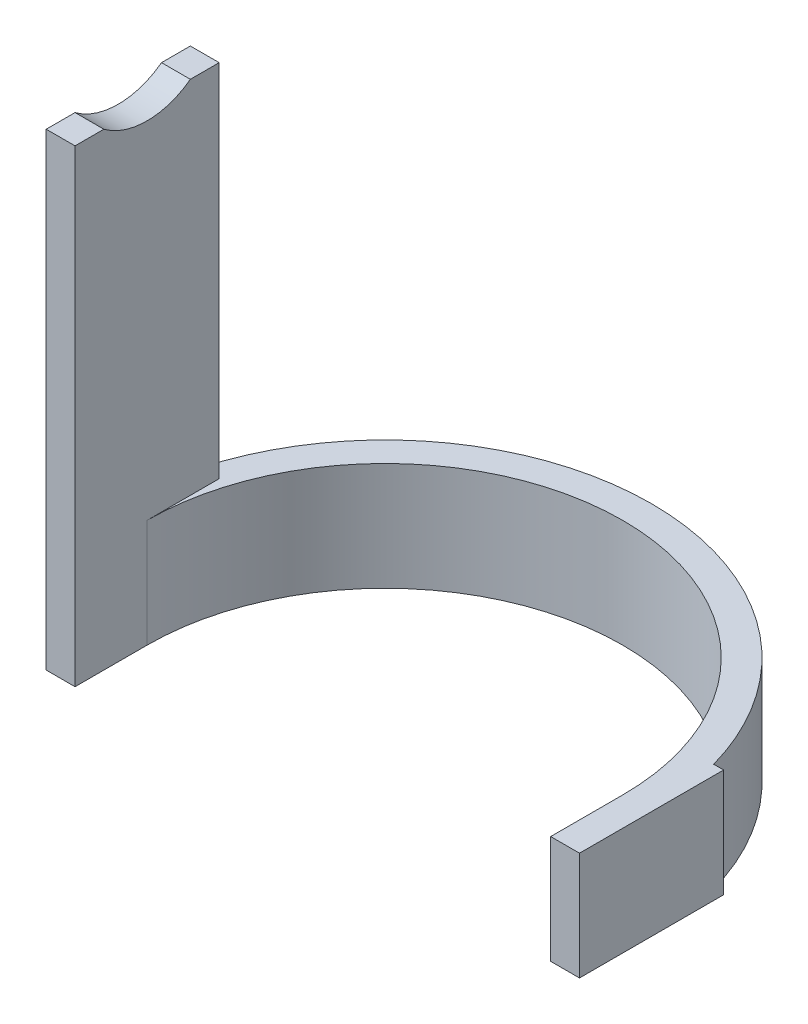
ISO-10303-21;
HEADER;
FILE_DESCRIPTION(('STEP AP214'),'2;1');
FILE_NAME('part.step','',(''),(''),'','','');
FILE_SCHEMA(('AUTOMOTIVE_DESIGN { 1 0 10303 214 1 1 1 1 }'));
ENDSEC;
DATA;
#1=APPLICATION_CONTEXT('core data for automotive mechanical design processes');
#2=APPLICATION_PROTOCOL_DEFINITION('international standard','automotive_design',2000,#1);
#3=PRODUCT_CONTEXT('',#1,'mechanical');
#4=PRODUCT('Part','Part','',(#3));
#5=PRODUCT_RELATED_PRODUCT_CATEGORY('part','',(#4));
#6=PRODUCT_DEFINITION_FORMATION('','',#4);
#7=PRODUCT_DEFINITION_CONTEXT('part definition',#1,'design');
#8=PRODUCT_DEFINITION('design','',#6,#7);
#9=PRODUCT_DEFINITION_SHAPE('','',#8);
#10=(LENGTH_UNIT() NAMED_UNIT(*) SI_UNIT(.MILLI.,.METRE.));
#11=(NAMED_UNIT(*) PLANE_ANGLE_UNIT() SI_UNIT($,.RADIAN.));
#12=(NAMED_UNIT(*) SI_UNIT($,.STERADIAN.) SOLID_ANGLE_UNIT());
#13=UNCERTAINTY_MEASURE_WITH_UNIT(LENGTH_MEASURE(1.E-05),#10,'distance_accuracy_value','');
#14=(GEOMETRIC_REPRESENTATION_CONTEXT(3) GLOBAL_UNCERTAINTY_ASSIGNED_CONTEXT((#13)) GLOBAL_UNIT_ASSIGNED_CONTEXT((#10,
#11,#12)) REPRESENTATION_CONTEXT('',''));
#15=CARTESIAN_POINT('',(0.,0.,0.));
#16=DIRECTION('',(0.,0.,1.));
#17=DIRECTION('',(1.,0.,0.));
#18=AXIS2_PLACEMENT_3D('',#15,#16,#17);
#19=CARTESIAN_POINT('',(0.,130.,0.));
#20=DIRECTION('',(0.,-1.,0.));
#21=DIRECTION('',(0.,0.,-1.));
#22=AXIS2_PLACEMENT_3D('',#19,#20,#21);
#23=PLANE('',#22);
#24=DIRECTION('',(0.,0.,-1.));
#25=VECTOR('',#24,1.);
#26=CARTESIAN_POINT('',(-66.,130.,20.));
#27=LINE('',#26,#25);
#28=CARTESIAN_POINT('',(-66.,130.,20.));
#29=VERTEX_POINT('',#28);
#30=CARTESIAN_POINT('',(-66.,130.,12.));
#31=VERTEX_POINT('',#30);
#32=EDGE_CURVE('E238',#29,#31,#27,.T.);
#33=ORIENTED_EDGE('',*,*,#32,.T.);
#34=DIRECTION('',(-1.,0.,0.));
#35=VECTOR('',#34,1.);
#36=CARTESIAN_POINT('',(74.,130.,12.));
#37=LINE('',#36,#35);
#38=CARTESIAN_POINT('',(-74.,130.,12.));
#39=VERTEX_POINT('',#38);
#40=EDGE_CURVE('E233',#31,#39,#37,.T.);
#41=ORIENTED_EDGE('',*,*,#40,.T.);
#42=DIRECTION('',(0.,0.,1.));
#43=VECTOR('',#42,1.);
#44=CARTESIAN_POINT('',(-74.,130.,20.));
#45=LINE('',#44,#43);
#46=CARTESIAN_POINT('',(-74.,130.,20.));
#47=VERTEX_POINT('',#46);
#48=EDGE_CURVE('E232',#39,#47,#45,.T.);
#49=ORIENTED_EDGE('',*,*,#48,.T.);
#50=DIRECTION('',(1.,0.,0.));
#51=VECTOR('',#50,1.);
#52=CARTESIAN_POINT('',(-74.,130.,20.));
#53=LINE('',#52,#51);
#54=EDGE_CURVE('E243',#47,#29,#53,.T.);
#55=ORIENTED_EDGE('',*,*,#54,.T.);
#56=EDGE_LOOP('',(#33,#41,#49,#55));
#57=FACE_BOUND('',#56,.T.);
#58=ADVANCED_FACE('F38',(#57),#23,.F.);
#59=CARTESIAN_POINT('',(0.,30.,0.));
#60=DIRECTION('',(0.,1.,0.));
#61=DIRECTION('',(0.,0.,1.));
#62=AXIS2_PLACEMENT_3D('',#59,#60,#61);
#63=PLANE('',#62);
#64=CARTESIAN_POINT('',(0.,30.,0.));
#65=DIRECTION('',(0.,-1.,0.));
#66=DIRECTION('',(0.,0.,1.));
#67=AXIS2_PLACEMENT_3D('',#64,#65,#66);
#68=CIRCLE('',#67,66.);
#69=CARTESIAN_POINT('',(-66.,30.,0.));
#70=VERTEX_POINT('',#69);
#71=CARTESIAN_POINT('',(66.,30.,0.));
#72=VERTEX_POINT('',#71);
#73=EDGE_CURVE('E191',#70,#72,#68,.T.);
#74=ORIENTED_EDGE('',*,*,#73,.T.);
#75=DIRECTION('',(0.,0.,-1.));
#76=VECTOR('',#75,1.);
#77=CARTESIAN_POINT('',(66.,30.,0.));
#78=LINE('',#77,#76);
#79=CARTESIAN_POINT('',(66.,30.,20.));
#80=VERTEX_POINT('',#79);
#81=EDGE_CURVE('E136',#80,#72,#78,.T.);
#82=ORIENTED_EDGE('',*,*,#81,.F.);
#83=DIRECTION('',(-1.,0.,0.));
#84=VECTOR('',#83,1.);
#85=CARTESIAN_POINT('',(74.,30.,20.));
#86=LINE('',#85,#84);
#87=CARTESIAN_POINT('',(74.,30.,20.));
#88=VERTEX_POINT('',#87);
#89=EDGE_CURVE('E133',#88,#80,#86,.T.);
#90=ORIENTED_EDGE('',*,*,#89,.F.);
#91=DIRECTION('',(0.,0.,-1.));
#92=VECTOR('',#91,1.);
#93=CARTESIAN_POINT('',(74.,30.,-20.));
#94=LINE('',#93,#92);
#95=CARTESIAN_POINT('',(74.,30.,-20.));
#96=VERTEX_POINT('',#95);
#97=EDGE_CURVE('E55',#88,#96,#94,.T.);
#98=ORIENTED_EDGE('',*,*,#97,.T.);
#99=DIRECTION('',(1.,0.,0.));
#100=VECTOR('',#99,1.);
#101=CARTESIAN_POINT('',(64.,30.,-20.));
#102=LINE('',#101,#100);
#103=CARTESIAN_POINT('',(71.2460525222275,30.,-20.));
#104=VERTEX_POINT('',#103);
#105=EDGE_CURVE('E141',#104,#96,#102,.T.);
#106=ORIENTED_EDGE('',*,*,#105,.F.);
#107=CARTESIAN_POINT('',(0.,30.,0.));
#108=DIRECTION('',(0.,1.,0.));
#109=DIRECTION('',(0.,0.,1.));
#110=AXIS2_PLACEMENT_3D('',#107,#108,#109);
#111=CIRCLE('',#110,74.);
#112=CARTESIAN_POINT('',(-71.2460525222275,30.,-20.));
#113=VERTEX_POINT('',#112);
#114=EDGE_CURVE('E187',#104,#113,#111,.T.);
#115=ORIENTED_EDGE('',*,*,#114,.T.);
#116=DIRECTION('',(-1.,0.,0.));
#117=VECTOR('',#116,1.);
#118=CARTESIAN_POINT('',(-74.,30.,-20.));
#119=LINE('',#118,#117);
#120=CARTESIAN_POINT('',(-66.,30.,-20.));
#121=VERTEX_POINT('',#120);
#122=EDGE_CURVE('E229',#121,#113,#119,.T.);
#123=ORIENTED_EDGE('',*,*,#122,.F.);
#124=DIRECTION('',(0.,0.,-1.));
#125=VECTOR('',#124,1.);
#126=CARTESIAN_POINT('',(-66.,30.,20.));
#127=LINE('',#126,#125);
#128=EDGE_CURVE('E11',#70,#121,#127,.T.);
#129=ORIENTED_EDGE('',*,*,#128,.F.);
#130=EDGE_LOOP('',(#74,#82,#90,#98,#106,#115,#123,#129));
#131=FACE_BOUND('',#130,.T.);
#132=ADVANCED_FACE('F134',(#131),#63,.T.);
#133=CARTESIAN_POINT('',(0.,30.,0.));
#134=DIRECTION('',(0.,-1.,0.));
#135=DIRECTION('',(0.,0.,-1.));
#136=AXIS2_PLACEMENT_3D('',#133,#134,#135);
#137=CYLINDRICAL_SURFACE('',#136,66.);
#138=CARTESIAN_POINT('',(0.,0.,0.));
#139=DIRECTION('',(0.,-1.,0.));
#140=DIRECTION('',(0.,0.,1.));
#141=AXIS2_PLACEMENT_3D('',#138,#139,#140);
#142=CIRCLE('',#141,66.);
#143=CARTESIAN_POINT('',(-66.,0.,0.));
#144=VERTEX_POINT('',#143);
#145=CARTESIAN_POINT('',(66.,0.,0.));
#146=VERTEX_POINT('',#145);
#147=EDGE_CURVE('E216',#144,#146,#142,.T.);
#148=ORIENTED_EDGE('',*,*,#147,.T.);
#149=DIRECTION('',(0.,-1.,0.));
#150=VECTOR('',#149,1.);
#151=CARTESIAN_POINT('',(66.,30.,0.));
#152=LINE('',#151,#150);
#153=EDGE_CURVE('E42',#72,#146,#152,.T.);
#154=ORIENTED_EDGE('',*,*,#153,.F.);
#155=ORIENTED_EDGE('',*,*,#73,.F.);
#156=DIRECTION('',(0.,-1.,0.));
#157=VECTOR('',#156,1.);
#158=CARTESIAN_POINT('',(-66.,30.,0.));
#159=LINE('',#158,#157);
#160=EDGE_CURVE('E183',#70,#144,#159,.T.);
#161=ORIENTED_EDGE('',*,*,#160,.T.);
#162=EDGE_LOOP('',(#148,#154,#155,#161));
#163=FACE_BOUND('',#162,.T.);
#164=ADVANCED_FACE('F40',(#163),#137,.F.);
#165=CARTESIAN_POINT('',(66.,30.,0.));
#166=DIRECTION('',(1.,0.,0.));
#167=DIRECTION('',(0.,0.,-1.));
#168=AXIS2_PLACEMENT_3D('',#165,#166,#167);
#169=PLANE('',#168);
#170=DIRECTION('',(0.,-1.,0.));
#171=VECTOR('',#170,1.);
#172=CARTESIAN_POINT('',(66.,30.,20.));
#173=LINE('',#172,#171);
#174=CARTESIAN_POINT('',(66.,0.,20.));
#175=VERTEX_POINT('',#174);
#176=EDGE_CURVE('E157',#80,#175,#173,.T.);
#177=ORIENTED_EDGE('',*,*,#176,.F.);
#178=ORIENTED_EDGE('',*,*,#81,.T.);
#179=ORIENTED_EDGE('',*,*,#153,.T.);
#180=DIRECTION('',(0.,0.,1.));
#181=VECTOR('',#180,1.);
#182=CARTESIAN_POINT('',(66.,0.,0.));
#183=LINE('',#182,#181);
#184=EDGE_CURVE('E212',#146,#175,#183,.T.);
#185=ORIENTED_EDGE('',*,*,#184,.T.);
#186=EDGE_LOOP('',(#177,#178,#179,#185));
#187=FACE_BOUND('',#186,.T.);
#188=ADVANCED_FACE('F289',(#187),#169,.F.);
#189=CARTESIAN_POINT('',(74.,30.,20.));
#190=DIRECTION('',(0.,0.,-1.));
#191=DIRECTION('',(-1.,0.,0.));
#192=AXIS2_PLACEMENT_3D('',#189,#190,#191);
#193=PLANE('',#192);
#194=DIRECTION('',(0.,-1.,0.));
#195=VECTOR('',#194,1.);
#196=CARTESIAN_POINT('',(74.,30.,20.));
#197=LINE('',#196,#195);
#198=CARTESIAN_POINT('',(74.,0.,20.));
#199=VERTEX_POINT('',#198);
#200=EDGE_CURVE('E147',#88,#199,#197,.T.);
#201=ORIENTED_EDGE('',*,*,#200,.F.);
#202=ORIENTED_EDGE('',*,*,#89,.T.);
#203=ORIENTED_EDGE('',*,*,#176,.T.);
#204=DIRECTION('',(1.,0.,0.));
#205=VECTOR('',#204,1.);
#206=CARTESIAN_POINT('',(74.,0.,20.));
#207=LINE('',#206,#205);
#208=EDGE_CURVE('E154',#175,#199,#207,.T.);
#209=ORIENTED_EDGE('',*,*,#208,.T.);
#210=EDGE_LOOP('',(#201,#202,#203,#209));
#211=FACE_BOUND('',#210,.T.);
#212=ADVANCED_FACE('F152',(#211),#193,.F.);
#213=CARTESIAN_POINT('',(74.,30.,-20.));
#214=DIRECTION('',(-1.,0.,0.));
#215=DIRECTION('',(0.,0.,1.));
#216=AXIS2_PLACEMENT_3D('',#213,#214,#215);
#217=PLANE('',#216);
#218=DIRECTION('',(0.,-1.,0.));
#219=VECTOR('',#218,1.);
#220=CARTESIAN_POINT('',(74.,30.,-20.));
#221=LINE('',#220,#219);
#222=CARTESIAN_POINT('',(74.,0.,-20.));
#223=VERTEX_POINT('',#222);
#224=EDGE_CURVE('E149',#96,#223,#221,.T.);
#225=ORIENTED_EDGE('',*,*,#224,.F.);
#226=ORIENTED_EDGE('',*,*,#97,.F.);
#227=ORIENTED_EDGE('',*,*,#200,.T.);
#228=DIRECTION('',(0.,0.,-1.));
#229=VECTOR('',#228,1.);
#230=CARTESIAN_POINT('',(74.,0.,-20.));
#231=LINE('',#230,#229);
#232=EDGE_CURVE('E207',#199,#223,#231,.T.);
#233=ORIENTED_EDGE('',*,*,#232,.T.);
#234=EDGE_LOOP('',(#225,#226,#227,#233));
#235=FACE_BOUND('',#234,.T.);
#236=ADVANCED_FACE('F145',(#235),#217,.F.);
#237=CARTESIAN_POINT('',(74.,30.,-20.));
#238=DIRECTION('',(0.,0.,1.));
#239=DIRECTION('',(1.,0.,0.));
#240=AXIS2_PLACEMENT_3D('',#237,#238,#239);
#241=PLANE('',#240);
#242=DIRECTION('',(0.,-1.,0.));
#243=VECTOR('',#242,1.);
#244=CARTESIAN_POINT('',(71.2460525222275,30.,-20.));
#245=LINE('',#244,#243);
#246=CARTESIAN_POINT('',(71.2460525222275,0.,-20.));
#247=VERTEX_POINT('',#246);
#248=EDGE_CURVE('E161',#104,#247,#245,.T.);
#249=ORIENTED_EDGE('',*,*,#248,.F.);
#250=ORIENTED_EDGE('',*,*,#105,.T.);
#251=ORIENTED_EDGE('',*,*,#224,.T.);
#252=DIRECTION('',(-1.,0.,0.));
#253=VECTOR('',#252,1.);
#254=CARTESIAN_POINT('',(74.,0.,-20.));
#255=LINE('',#254,#253);
#256=EDGE_CURVE('E204',#223,#247,#255,.T.);
#257=ORIENTED_EDGE('',*,*,#256,.T.);
#258=EDGE_LOOP('',(#249,#250,#251,#257));
#259=FACE_BOUND('',#258,.T.);
#260=ADVANCED_FACE('F267',(#259),#241,.F.);
#261=CARTESIAN_POINT('',(0.,30.,0.));
#262=DIRECTION('',(0.,-1.,0.));
#263=DIRECTION('',(0.,0.,-1.));
#264=AXIS2_PLACEMENT_3D('',#261,#262,#263);
#265=CYLINDRICAL_SURFACE('',#264,74.);
#266=CARTESIAN_POINT('',(0.,0.,0.));
#267=DIRECTION('',(0.,1.,0.));
#268=DIRECTION('',(0.,0.,1.));
#269=AXIS2_PLACEMENT_3D('',#266,#267,#268);
#270=CIRCLE('',#269,74.);
#271=CARTESIAN_POINT('',(-71.2460525222275,0.,-20.));
#272=VERTEX_POINT('',#271);
#273=EDGE_CURVE('E201',#247,#272,#270,.T.);
#274=ORIENTED_EDGE('',*,*,#273,.T.);
#275=DIRECTION('',(0.,-1.,0.));
#276=VECTOR('',#275,1.);
#277=CARTESIAN_POINT('',(-71.2460525222275,30.,-20.));
#278=LINE('',#277,#276);
#279=EDGE_CURVE('E167',#113,#272,#278,.T.);
#280=ORIENTED_EDGE('',*,*,#279,.F.);
#281=ORIENTED_EDGE('',*,*,#114,.F.);
#282=ORIENTED_EDGE('',*,*,#248,.T.);
#283=EDGE_LOOP('',(#274,#280,#281,#282));
#284=FACE_BOUND('',#283,.T.);
#285=ADVANCED_FACE('F271',(#284),#265,.T.);
#286=CARTESIAN_POINT('',(-74.,30.,-20.));
#287=DIRECTION('',(0.,0.,1.));
#288=DIRECTION('',(1.,0.,0.));
#289=AXIS2_PLACEMENT_3D('',#286,#287,#288);
#290=PLANE('',#289);
#291=DIRECTION('',(-1.,0.,0.));
#292=VECTOR('',#291,1.);
#293=CARTESIAN_POINT('',(-74.,0.,-20.));
#294=LINE('',#293,#292);
#295=CARTESIAN_POINT('',(-74.,0.,-20.));
#296=VERTEX_POINT('',#295);
#297=EDGE_CURVE('E198',#272,#296,#294,.T.);
#298=ORIENTED_EDGE('',*,*,#297,.T.);
#299=DIRECTION('',(0.,-1.,0.));
#300=VECTOR('',#299,1.);
#301=CARTESIAN_POINT('',(-74.,30.,-20.));
#302=LINE('',#301,#300);
#303=CARTESIAN_POINT('',(-74.,130.,-20.));
#304=VERTEX_POINT('',#303);
#305=EDGE_CURVE('E171',#304,#296,#302,.T.);
#306=ORIENTED_EDGE('',*,*,#305,.F.);
#307=DIRECTION('',(-1.,0.,0.));
#308=VECTOR('',#307,1.);
#309=CARTESIAN_POINT('',(-74.,130.,-20.));
#310=LINE('',#309,#308);
#311=CARTESIAN_POINT('',(-66.,130.,-20.));
#312=VERTEX_POINT('',#311);
#313=EDGE_CURVE('E228',#312,#304,#310,.T.);
#314=ORIENTED_EDGE('',*,*,#313,.F.);
#315=DIRECTION('',(0.,-1.,0.));
#316=VECTOR('',#315,1.);
#317=CARTESIAN_POINT('',(-66.,130.,-20.));
#318=LINE('',#317,#316);
#319=EDGE_CURVE('E220',#312,#121,#318,.T.);
#320=ORIENTED_EDGE('',*,*,#319,.T.);
#321=ORIENTED_EDGE('',*,*,#122,.T.);
#322=ORIENTED_EDGE('',*,*,#279,.T.);
#323=EDGE_LOOP('',(#298,#306,#314,#320,#321,#322));
#324=FACE_BOUND('',#323,.T.);
#325=ADVANCED_FACE('F275',(#324),#290,.F.);
#326=CARTESIAN_POINT('',(-74.,30.,-20.));
#327=DIRECTION('',(1.,0.,0.));
#328=DIRECTION('',(0.,0.,-1.));
#329=AXIS2_PLACEMENT_3D('',#326,#327,#328);
#330=PLANE('',#329);
#331=ORIENTED_EDGE('',*,*,#48,.F.);
#332=CARTESIAN_POINT('',(-74.,146.,0.));
#333=DIRECTION('',(-1.,0.,0.));
#334=DIRECTION('',(0.,0.,1.));
#335=AXIS2_PLACEMENT_3D('',#332,#333,#334);
#336=CIRCLE('',#335,20.);
#337=CARTESIAN_POINT('',(-74.,130.,-12.));
#338=VERTEX_POINT('',#337);
#339=EDGE_CURVE('E259',#338,#39,#336,.T.);
#340=ORIENTED_EDGE('',*,*,#339,.F.);
#341=EDGE_CURVE('E247',#304,#338,#45,.T.);
#342=ORIENTED_EDGE('',*,*,#341,.F.);
#343=ORIENTED_EDGE('',*,*,#305,.T.);
#344=DIRECTION('',(0.,0.,1.));
#345=VECTOR('',#344,1.);
#346=CARTESIAN_POINT('',(-74.,0.,-20.));
#347=LINE('',#346,#345);
#348=CARTESIAN_POINT('',(-74.,0.,20.));
#349=VERTEX_POINT('',#348);
#350=EDGE_CURVE('E195',#296,#349,#347,.T.);
#351=ORIENTED_EDGE('',*,*,#350,.T.);
#352=DIRECTION('',(0.,-1.,0.));
#353=VECTOR('',#352,1.);
#354=CARTESIAN_POINT('',(-74.,30.,20.));
#355=LINE('',#354,#353);
#356=EDGE_CURVE('E175',#47,#349,#355,.T.);
#357=ORIENTED_EDGE('',*,*,#356,.F.);
#358=EDGE_LOOP('',(#331,#340,#342,#343,#351,#357));
#359=FACE_BOUND('',#358,.T.);
#360=ADVANCED_FACE('F298',(#359),#330,.F.);
#361=CARTESIAN_POINT('',(-74.,30.,20.));
#362=DIRECTION('',(0.,0.,-1.));
#363=DIRECTION('',(-1.,0.,0.));
#364=AXIS2_PLACEMENT_3D('',#361,#362,#363);
#365=PLANE('',#364);
#366=DIRECTION('',(1.,0.,0.));
#367=VECTOR('',#366,1.);
#368=CARTESIAN_POINT('',(-74.,0.,20.));
#369=LINE('',#368,#367);
#370=CARTESIAN_POINT('',(-66.,0.,20.));
#371=VERTEX_POINT('',#370);
#372=EDGE_CURVE('E192',#349,#371,#369,.T.);
#373=ORIENTED_EDGE('',*,*,#372,.T.);
#374=DIRECTION('',(0.,-1.,0.));
#375=VECTOR('',#374,1.);
#376=CARTESIAN_POINT('',(-66.,30.,20.));
#377=LINE('',#376,#375);
#378=EDGE_CURVE('E179',#29,#371,#377,.T.);
#379=ORIENTED_EDGE('',*,*,#378,.F.);
#380=ORIENTED_EDGE('',*,*,#54,.F.);
#381=ORIENTED_EDGE('',*,*,#356,.T.);
#382=EDGE_LOOP('',(#373,#379,#380,#381));
#383=FACE_BOUND('',#382,.T.);
#384=ADVANCED_FACE('F309',(#383),#365,.F.);
#385=CARTESIAN_POINT('',(-66.,30.,0.));
#386=DIRECTION('',(-1.,0.,0.));
#387=DIRECTION('',(0.,0.,1.));
#388=AXIS2_PLACEMENT_3D('',#385,#386,#387);
#389=PLANE('',#388);
#390=CARTESIAN_POINT('',(-66.,130.,-12.));
#391=VERTEX_POINT('',#390);
#392=EDGE_CURVE('E242',#391,#312,#27,.T.);
#393=ORIENTED_EDGE('',*,*,#392,.F.);
#394=CARTESIAN_POINT('',(-66.,146.,0.));
#395=DIRECTION('',(-1.,0.,0.));
#396=DIRECTION('',(0.,0.,1.));
#397=AXIS2_PLACEMENT_3D('',#394,#395,#396);
#398=CIRCLE('',#397,20.);
#399=EDGE_CURVE('E63',#391,#31,#398,.T.);
#400=ORIENTED_EDGE('',*,*,#399,.T.);
#401=ORIENTED_EDGE('',*,*,#32,.F.);
#402=ORIENTED_EDGE('',*,*,#378,.T.);
#403=DIRECTION('',(0.,0.,-1.));
#404=VECTOR('',#403,1.);
#405=CARTESIAN_POINT('',(-66.,0.,0.));
#406=LINE('',#405,#404);
#407=EDGE_CURVE('E188',#371,#144,#406,.T.);
#408=ORIENTED_EDGE('',*,*,#407,.T.);
#409=ORIENTED_EDGE('',*,*,#160,.F.);
#410=ORIENTED_EDGE('',*,*,#128,.T.);
#411=ORIENTED_EDGE('',*,*,#319,.F.);
#412=EDGE_LOOP('',(#393,#400,#401,#402,#408,#409,#410,#411));
#413=FACE_BOUND('',#412,.T.);
#414=ADVANCED_FACE('F281',(#413),#389,.F.);
#415=CARTESIAN_POINT('',(0.,0.,0.));
#416=DIRECTION('',(0.,1.,0.));
#417=DIRECTION('',(0.,0.,1.));
#418=AXIS2_PLACEMENT_3D('',#415,#416,#417);
#419=PLANE('',#418);
#420=ORIENTED_EDGE('',*,*,#147,.F.);
#421=ORIENTED_EDGE('',*,*,#407,.F.);
#422=ORIENTED_EDGE('',*,*,#372,.F.);
#423=ORIENTED_EDGE('',*,*,#350,.F.);
#424=ORIENTED_EDGE('',*,*,#297,.F.);
#425=ORIENTED_EDGE('',*,*,#273,.F.);
#426=ORIENTED_EDGE('',*,*,#256,.F.);
#427=ORIENTED_EDGE('',*,*,#232,.F.);
#428=ORIENTED_EDGE('',*,*,#208,.F.);
#429=ORIENTED_EDGE('',*,*,#184,.F.);
#430=EDGE_LOOP('',(#420,#421,#422,#423,#424,#425,#426,#427,#428,#429));
#431=FACE_BOUND('',#430,.T.);
#432=ADVANCED_FACE('F291',(#431),#419,.F.);
#433=ORIENTED_EDGE('',*,*,#341,.T.);
#434=DIRECTION('',(-1.,0.,0.));
#435=VECTOR('',#434,1.);
#436=CARTESIAN_POINT('',(74.,130.,-12.));
#437=LINE('',#436,#435);
#438=EDGE_CURVE('E256',#338,#391,#437,.F.);
#439=ORIENTED_EDGE('',*,*,#438,.T.);
#440=ORIENTED_EDGE('',*,*,#392,.T.);
#441=ORIENTED_EDGE('',*,*,#313,.T.);
#442=EDGE_LOOP('',(#433,#439,#440,#441));
#443=FACE_BOUND('',#442,.T.);
#444=ADVANCED_FACE('F302',(#443),#23,.F.);
#445=CARTESIAN_POINT('',(74.,146.,0.));
#446=DIRECTION('',(-1.,0.,0.));
#447=DIRECTION('',(0.,0.,1.));
#448=AXIS2_PLACEMENT_3D('',#445,#446,#447);
#449=CYLINDRICAL_SURFACE('',#448,20.);
#450=ORIENTED_EDGE('',*,*,#399,.F.);
#451=ORIENTED_EDGE('',*,*,#438,.F.);
#452=ORIENTED_EDGE('',*,*,#339,.T.);
#453=ORIENTED_EDGE('',*,*,#40,.F.);
#454=EDGE_LOOP('',(#450,#451,#452,#453));
#455=FACE_BOUND('',#454,.T.);
#456=ADVANCED_FACE('F327',(#455),#449,.F.);
#457=CLOSED_SHELL('',(#58,#132,#164,#188,#212,#236,#260,#285,#325,#360,#384,#414,#432,#444,#456));
#458=MANIFOLD_SOLID_BREP('B2',#457);
#459=ADVANCED_BREP_SHAPE_REPRESENTATION('',(#18,#458),#14);
#460=SHAPE_DEFINITION_REPRESENTATION(#9,#459);
ENDSEC;
END-ISO-10303-21;
